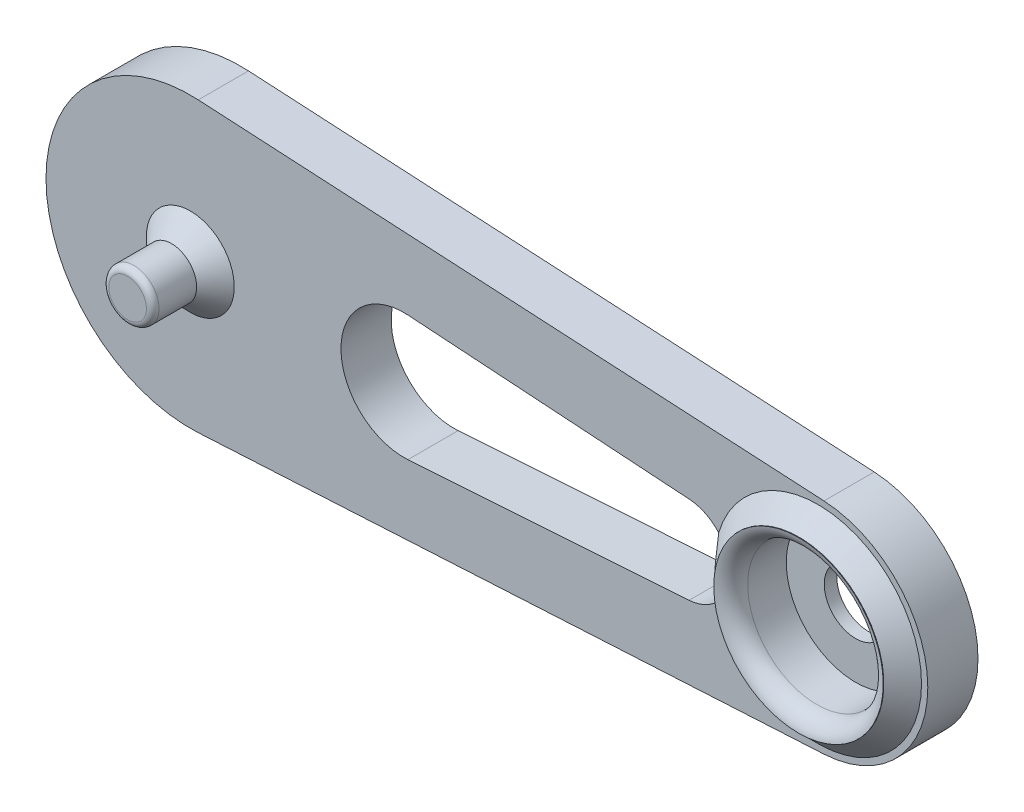
ISO-10303-21;
HEADER;
FILE_DESCRIPTION(('STEP AP214'),'2;1');
FILE_NAME('part.step','',(''),(''),'','','');
FILE_SCHEMA(('AUTOMOTIVE_DESIGN { 1 0 10303 214 1 1 1 1 }'));
ENDSEC;
DATA;
#1=APPLICATION_CONTEXT('core data for automotive mechanical design processes');
#2=APPLICATION_PROTOCOL_DEFINITION('international standard','automotive_design',2000,#1);
#3=PRODUCT_CONTEXT('',#1,'mechanical');
#4=PRODUCT('Part','Part','',(#3));
#5=PRODUCT_RELATED_PRODUCT_CATEGORY('part','',(#4));
#6=PRODUCT_DEFINITION_FORMATION('','',#4);
#7=PRODUCT_DEFINITION_CONTEXT('part definition',#1,'design');
#8=PRODUCT_DEFINITION('design','',#6,#7);
#9=PRODUCT_DEFINITION_SHAPE('','',#8);
#10=(LENGTH_UNIT() NAMED_UNIT(*) SI_UNIT(.MILLI.,.METRE.));
#11=(NAMED_UNIT(*) PLANE_ANGLE_UNIT() SI_UNIT($,.RADIAN.));
#12=(NAMED_UNIT(*) SI_UNIT($,.STERADIAN.) SOLID_ANGLE_UNIT());
#13=UNCERTAINTY_MEASURE_WITH_UNIT(LENGTH_MEASURE(1.E-05),#10,'distance_accuracy_value','');
#14=(GEOMETRIC_REPRESENTATION_CONTEXT(3) GLOBAL_UNCERTAINTY_ASSIGNED_CONTEXT((#13)) GLOBAL_UNIT_ASSIGNED_CONTEXT((#10,
#11,#12)) REPRESENTATION_CONTEXT('',''));
#15=CARTESIAN_POINT('',(0.,0.,0.));
#16=DIRECTION('',(0.,0.,1.));
#17=DIRECTION('',(1.,0.,0.));
#18=AXIS2_PLACEMENT_3D('',#15,#16,#17);
#19=CARTESIAN_POINT('',(100.,0.,-8.));
#20=DIRECTION('',(0.,0.,1.));
#21=DIRECTION('',(1.,0.,0.));
#22=AXIS2_PLACEMENT_3D('',#19,#20,#21);
#23=CYLINDRICAL_SURFACE('',#22,5.);
#24=CARTESIAN_POINT('',(100.,0.,-8.));
#25=DIRECTION('',(0.,0.,1.));
#26=DIRECTION('',(1.,0.,0.));
#27=AXIS2_PLACEMENT_3D('',#24,#25,#26);
#28=CIRCLE('',#27,5.);
#29=CARTESIAN_POINT('',(105.,0.,-8.));
#30=VERTEX_POINT('',#29);
#31=EDGE_CURVE('E159',#30,#30,#28,.T.);
#32=ORIENTED_EDGE('',*,*,#31,.F.);
#33=EDGE_LOOP('',(#32));
#34=FACE_BOUND('',#33,.T.);
#35=CARTESIAN_POINT('',(100.,0.,-6.));
#36=DIRECTION('',(0.,0.,1.));
#37=DIRECTION('',(1.,0.,0.));
#38=AXIS2_PLACEMENT_3D('',#35,#36,#37);
#39=CIRCLE('',#38,5.);
#40=CARTESIAN_POINT('',(105.,0.,-6.));
#41=VERTEX_POINT('',#40);
#42=EDGE_CURVE('E211',#41,#41,#39,.F.);
#43=ORIENTED_EDGE('',*,*,#42,.F.);
#44=EDGE_LOOP('',(#43));
#45=FACE_BOUND('',#44,.T.);
#46=ADVANCED_FACE('F41',(#34,#45),#23,.F.);
#47=CARTESIAN_POINT('',(0.,0.,10.));
#48=DIRECTION('',(0.,0.,-1.));
#49=DIRECTION('',(-1.,0.,0.));
#50=AXIS2_PLACEMENT_3D('',#47,#48,#49);
#51=CYLINDRICAL_SURFACE('',#50,4.);
#52=CARTESIAN_POINT('',(0.,0.,9.));
#53=DIRECTION('',(0.,0.,1.));
#54=DIRECTION('',(1.,0.,0.));
#55=AXIS2_PLACEMENT_3D('',#52,#53,#54);
#56=CIRCLE('',#55,4.);
#57=CARTESIAN_POINT('',(4.,0.,9.));
#58=VERTEX_POINT('',#57);
#59=EDGE_CURVE('E207',#58,#58,#56,.F.);
#60=ORIENTED_EDGE('',*,*,#59,.T.);
#61=EDGE_LOOP('',(#60));
#62=FACE_BOUND('',#61,.T.);
#63=CARTESIAN_POINT('',(0.,0.,3.00000000000001));
#64=DIRECTION('',(0.,0.,1.));
#65=DIRECTION('',(1.,0.,0.));
#66=AXIS2_PLACEMENT_3D('',#63,#64,#65);
#67=CIRCLE('',#66,4.);
#68=CARTESIAN_POINT('',(-4.,0.,3.00000000000001));
#69=VERTEX_POINT('',#68);
#70=EDGE_CURVE('E193',#69,#69,#67,.T.);
#71=ORIENTED_EDGE('',*,*,#70,.T.);
#72=EDGE_LOOP('',(#71));
#73=FACE_BOUND('',#72,.T.);
#74=ADVANCED_FACE('F237',(#62,#73),#51,.T.);
#75=CARTESIAN_POINT('',(0.,0.,10.));
#76=DIRECTION('',(0.,0.,1.));
#77=DIRECTION('',(1.,0.,0.));
#78=AXIS2_PLACEMENT_3D('',#75,#76,#77);
#79=PLANE('',#78);
#80=CARTESIAN_POINT('',(0.,0.,10.));
#81=DIRECTION('',(0.,0.,1.));
#82=DIRECTION('',(1.,0.,0.));
#83=AXIS2_PLACEMENT_3D('',#80,#81,#82);
#84=CIRCLE('',#83,3.);
#85=CARTESIAN_POINT('',(3.,0.,10.));
#86=VERTEX_POINT('',#85);
#87=EDGE_CURVE('E204',#86,#86,#84,.T.);
#88=ORIENTED_EDGE('',*,*,#87,.T.);
#89=EDGE_LOOP('',(#88));
#90=FACE_BOUND('',#89,.T.);
#91=ADVANCED_FACE('F245',(#90),#79,.T.);
#92=CARTESIAN_POINT('',(100.,0.,-8.));
#93=DIRECTION('',(0.,0.,1.));
#94=DIRECTION('',(1.,0.,0.));
#95=AXIS2_PLACEMENT_3D('',#92,#93,#94);
#96=CYLINDRICAL_SURFACE('',#95,17.5);
#97=CARTESIAN_POINT('',(100.,0.,0.));
#98=DIRECTION('',(0.,0.,1.));
#99=DIRECTION('',(1.,0.,0.));
#100=AXIS2_PLACEMENT_3D('',#97,#98,#99);
#101=CIRCLE('',#100,17.5);
#102=CARTESIAN_POINT('',(100.9625,-17.4735112026747,0.));
#103=VERTEX_POINT('',#102);
#104=CARTESIAN_POINT('',(100.9625,17.4735112026748,0.));
#105=VERTEX_POINT('',#104);
#106=EDGE_CURVE('E166',#103,#105,#101,.T.);
#107=ORIENTED_EDGE('',*,*,#106,.F.);
#108=DIRECTION('',(0.,0.,1.));
#109=VECTOR('',#108,1.);
#110=CARTESIAN_POINT('',(100.9625,-17.4735112026747,-8.));
#111=LINE('',#110,#109);
#112=CARTESIAN_POINT('',(100.9625,-17.4735112026747,-8.));
#113=VERTEX_POINT('',#112);
#114=EDGE_CURVE('E191',#113,#103,#111,.T.);
#115=ORIENTED_EDGE('',*,*,#114,.F.);
#116=CARTESIAN_POINT('',(100.,0.,-8.));
#117=DIRECTION('',(0.,0.,1.));
#118=DIRECTION('',(1.,0.,0.));
#119=AXIS2_PLACEMENT_3D('',#116,#117,#118);
#120=CIRCLE('',#119,17.5);
#121=CARTESIAN_POINT('',(100.9625,17.4735112026748,-8.));
#122=VERTEX_POINT('',#121);
#123=EDGE_CURVE('E167',#113,#122,#120,.T.);
#124=ORIENTED_EDGE('',*,*,#123,.T.);
#125=DIRECTION('',(0.,0.,1.));
#126=VECTOR('',#125,1.);
#127=CARTESIAN_POINT('',(100.9625,17.4735112026748,-8.));
#128=LINE('',#127,#126);
#129=EDGE_CURVE('E180',#122,#105,#128,.T.);
#130=ORIENTED_EDGE('',*,*,#129,.T.);
#131=EDGE_LOOP('',(#107,#115,#124,#130));
#132=FACE_BOUND('',#131,.T.);
#133=ADVANCED_FACE('F262',(#132),#96,.T.);
#134=CARTESIAN_POINT('',(100.9625,-17.4735112026747,-8.));
#135=DIRECTION('',(0.0550000000000001,-0.998486354438557,0.));
#136=DIRECTION('',(0.998486354438557,0.0550000000000001,0.));
#137=AXIS2_PLACEMENT_3D('',#134,#135,#136);
#138=PLANE('',#137);
#139=DIRECTION('',(0.998486354438557,0.0550000000000001,0.));
#140=VECTOR('',#139,1.);
#141=CARTESIAN_POINT('',(100.9625,-17.4735112026747,0.));
#142=LINE('',#141,#140);
#143=CARTESIAN_POINT('',(1.265,-22.9651861520868,0.));
#144=VERTEX_POINT('',#143);
#145=EDGE_CURVE('E171',#144,#103,#142,.T.);
#146=ORIENTED_EDGE('',*,*,#145,.F.);
#147=DIRECTION('',(0.,0.,1.));
#148=VECTOR('',#147,1.);
#149=CARTESIAN_POINT('',(1.265,-22.9651861520868,-8.));
#150=LINE('',#149,#148);
#151=CARTESIAN_POINT('',(1.265,-22.9651861520868,-8.));
#152=VERTEX_POINT('',#151);
#153=EDGE_CURVE('E194',#152,#144,#150,.T.);
#154=ORIENTED_EDGE('',*,*,#153,.F.);
#155=DIRECTION('',(0.998486354438557,0.0550000000000001,0.));
#156=VECTOR('',#155,1.);
#157=CARTESIAN_POINT('',(100.9625,-17.4735112026747,-8.));
#158=LINE('',#157,#156);
#159=EDGE_CURVE('E177',#152,#113,#158,.T.);
#160=ORIENTED_EDGE('',*,*,#159,.T.);
#161=ORIENTED_EDGE('',*,*,#114,.T.);
#162=EDGE_LOOP('',(#146,#154,#160,#161));
#163=FACE_BOUND('',#162,.T.);
#164=ADVANCED_FACE('F258',(#163),#138,.T.);
#165=CARTESIAN_POINT('',(0.,0.,-8.));
#166=DIRECTION('',(0.,0.,1.));
#167=DIRECTION('',(1.,0.,0.));
#168=AXIS2_PLACEMENT_3D('',#165,#166,#167);
#169=CYLINDRICAL_SURFACE('',#168,23.);
#170=CARTESIAN_POINT('',(0.,0.,0.));
#171=DIRECTION('',(0.,0.,1.));
#172=DIRECTION('',(1.,0.,0.));
#173=AXIS2_PLACEMENT_3D('',#170,#171,#172);
#174=CIRCLE('',#173,23.);
#175=CARTESIAN_POINT('',(1.265,22.9651861520868,0.));
#176=VERTEX_POINT('',#175);
#177=EDGE_CURVE('E186',#176,#144,#174,.T.);
#178=ORIENTED_EDGE('',*,*,#177,.F.);
#179=DIRECTION('',(0.,0.,1.));
#180=VECTOR('',#179,1.);
#181=CARTESIAN_POINT('',(1.265,22.9651861520868,-8.));
#182=LINE('',#181,#180);
#183=CARTESIAN_POINT('',(1.265,22.9651861520868,-8.));
#184=VERTEX_POINT('',#183);
#185=EDGE_CURVE('E196',#184,#176,#182,.T.);
#186=ORIENTED_EDGE('',*,*,#185,.F.);
#187=CARTESIAN_POINT('',(0.,0.,-8.));
#188=DIRECTION('',(0.,0.,1.));
#189=DIRECTION('',(1.,0.,0.));
#190=AXIS2_PLACEMENT_3D('',#187,#188,#189);
#191=CIRCLE('',#190,23.);
#192=EDGE_CURVE('E174',#184,#152,#191,.T.);
#193=ORIENTED_EDGE('',*,*,#192,.T.);
#194=ORIENTED_EDGE('',*,*,#153,.T.);
#195=EDGE_LOOP('',(#178,#186,#193,#194));
#196=FACE_BOUND('',#195,.T.);
#197=ADVANCED_FACE('F261',(#196),#169,.T.);
#198=CARTESIAN_POINT('',(100.9625,17.4735112026748,-8.));
#199=DIRECTION('',(0.0549999999999998,0.998486354438557,0.));
#200=DIRECTION('',(-0.998486354438557,0.0549999999999998,0.));
#201=AXIS2_PLACEMENT_3D('',#198,#199,#200);
#202=PLANE('',#201);
#203=DIRECTION('',(-0.998486354438557,0.0549999999999998,0.));
#204=VECTOR('',#203,1.);
#205=CARTESIAN_POINT('',(100.9625,17.4735112026748,0.));
#206=LINE('',#205,#204);
#207=EDGE_CURVE('E183',#105,#176,#206,.T.);
#208=ORIENTED_EDGE('',*,*,#207,.F.);
#209=ORIENTED_EDGE('',*,*,#129,.F.);
#210=DIRECTION('',(-0.998486354438557,0.0549999999999998,0.));
#211=VECTOR('',#210,1.);
#212=CARTESIAN_POINT('',(100.9625,17.4735112026748,-8.));
#213=LINE('',#212,#211);
#214=EDGE_CURVE('E170',#122,#184,#213,.T.);
#215=ORIENTED_EDGE('',*,*,#214,.T.);
#216=ORIENTED_EDGE('',*,*,#185,.T.);
#217=EDGE_LOOP('',(#208,#209,#215,#216));
#218=FACE_BOUND('',#217,.T.);
#219=ADVANCED_FACE('F254',(#218),#202,.T.);
#220=CARTESIAN_POINT('',(100.,0.,-8.));
#221=DIRECTION('',(0.,0.,1.));
#222=DIRECTION('',(1.,0.,0.));
#223=AXIS2_PLACEMENT_3D('',#220,#221,#222);
#224=PLANE('',#223);
#225=DIRECTION('',(-0.997775303139718,0.0666666666666665,0.));
#226=VECTOR('',#225,1.);
#227=CARTESIAN_POINT('',(34.6666666666667,9.97775303139718,-8.));
#228=LINE('',#227,#226);
#229=CARTESIAN_POINT('',(79.4666666666667,6.98442712197804,-8.));
#230=VERTEX_POINT('',#229);
#231=CARTESIAN_POINT('',(34.6666666666667,9.97775303139718,-8.));
#232=VERTEX_POINT('',#231);
#233=EDGE_CURVE('E128',#230,#232,#228,.T.);
#234=ORIENTED_EDGE('',*,*,#233,.T.);
#235=CARTESIAN_POINT('',(34.,0.,-8.));
#236=DIRECTION('',(0.,0.,1.));
#237=DIRECTION('',(1.,0.,0.));
#238=AXIS2_PLACEMENT_3D('',#235,#236,#237);
#239=CIRCLE('',#238,10.);
#240=CARTESIAN_POINT('',(34.6666666666667,-9.97775303139718,-8.));
#241=VERTEX_POINT('',#240);
#242=EDGE_CURVE('E120',#232,#241,#239,.T.);
#243=ORIENTED_EDGE('',*,*,#242,.T.);
#244=DIRECTION('',(0.997775303139718,0.0666666666666668,0.));
#245=VECTOR('',#244,1.);
#246=CARTESIAN_POINT('',(34.6666666666667,-9.97775303139718,-8.));
#247=LINE('',#246,#245);
#248=CARTESIAN_POINT('',(79.4666666666667,-6.98442712197802,-8.));
#249=VERTEX_POINT('',#248);
#250=EDGE_CURVE('E132',#241,#249,#247,.T.);
#251=ORIENTED_EDGE('',*,*,#250,.T.);
#252=CARTESIAN_POINT('',(79.,0.,-8.));
#253=DIRECTION('',(0.,0.,1.));
#254=DIRECTION('',(1.,0.,0.));
#255=AXIS2_PLACEMENT_3D('',#252,#253,#254);
#256=CIRCLE('',#255,7.);
#257=EDGE_CURVE('E136',#249,#230,#256,.T.);
#258=ORIENTED_EDGE('',*,*,#257,.T.);
#259=EDGE_LOOP('',(#234,#243,#251,#258));
#260=FACE_BOUND('',#259,.T.);
#261=ORIENTED_EDGE('',*,*,#31,.T.);
#262=EDGE_LOOP('',(#261));
#263=FACE_BOUND('',#262,.T.);
#264=ORIENTED_EDGE('',*,*,#123,.F.);
#265=ORIENTED_EDGE('',*,*,#159,.F.);
#266=ORIENTED_EDGE('',*,*,#192,.F.);
#267=ORIENTED_EDGE('',*,*,#214,.F.);
#268=EDGE_LOOP('',(#264,#265,#266,#267));
#269=FACE_BOUND('',#268,.T.);
#270=ADVANCED_FACE('F138',(#260,#263,#269),#224,.F.);
#271=CARTESIAN_POINT('',(100.,0.,0.));
#272=DIRECTION('',(0.,0.,1.));
#273=DIRECTION('',(1.,0.,0.));
#274=AXIS2_PLACEMENT_3D('',#271,#272,#273);
#275=PLANE('',#274);
#276=CARTESIAN_POINT('',(0.,0.,0.));
#277=DIRECTION('',(0.,0.,1.));
#278=DIRECTION('',(1.,0.,0.));
#279=AXIS2_PLACEMENT_3D('',#276,#277,#278);
#280=CIRCLE('',#279,6.99999999999998);
#281=CARTESIAN_POINT('',(-6.99999999999998,0.,0.));
#282=VERTEX_POINT('',#281);
#283=EDGE_CURVE('E201',#282,#282,#280,.F.);
#284=ORIENTED_EDGE('',*,*,#283,.T.);
#285=EDGE_LOOP('',(#284));
#286=FACE_BOUND('',#285,.T.);
#287=CARTESIAN_POINT('',(79.,0.,0.));
#288=DIRECTION('',(0.,0.,1.));
#289=DIRECTION('',(1.,0.,0.));
#290=AXIS2_PLACEMENT_3D('',#287,#288,#289);
#291=CIRCLE('',#290,7.);
#292=CARTESIAN_POINT('',(84.1845238095238,4.70326619153976,0.));
#293=VERTEX_POINT('',#292);
#294=CARTESIAN_POINT('',(79.4666666666667,6.98442712197804,0.));
#295=VERTEX_POINT('',#294);
#296=EDGE_CURVE('E155',#293,#295,#291,.T.);
#297=ORIENTED_EDGE('',*,*,#296,.F.);
#298=CARTESIAN_POINT('',(100.,0.,0.));
#299=DIRECTION('',(0.,0.,1.));
#300=DIRECTION('',(1.,0.,0.));
#301=AXIS2_PLACEMENT_3D('',#298,#299,#300);
#302=CIRCLE('',#301,16.5);
#303=CARTESIAN_POINT('',(84.1845238095238,-4.70326619153974,0.));
#304=VERTEX_POINT('',#303);
#305=EDGE_CURVE('E56',#293,#304,#302,.F.);
#306=ORIENTED_EDGE('',*,*,#305,.T.);
#307=CARTESIAN_POINT('',(79.4666666666667,-6.98442712197802,0.));
#308=VERTEX_POINT('',#307);
#309=EDGE_CURVE('E144',#308,#304,#291,.T.);
#310=ORIENTED_EDGE('',*,*,#309,.F.);
#311=DIRECTION('',(0.997775303139718,0.0666666666666668,0.));
#312=VECTOR('',#311,1.);
#313=CARTESIAN_POINT('',(34.6666666666667,-9.97775303139718,0.));
#314=LINE('',#313,#312);
#315=CARTESIAN_POINT('',(34.6666666666667,-9.97775303139718,0.));
#316=VERTEX_POINT('',#315);
#317=EDGE_CURVE('E153',#316,#308,#314,.T.);
#318=ORIENTED_EDGE('',*,*,#317,.F.);
#319=CARTESIAN_POINT('',(34.,0.,0.));
#320=DIRECTION('',(0.,0.,1.));
#321=DIRECTION('',(1.,0.,0.));
#322=AXIS2_PLACEMENT_3D('',#319,#320,#321);
#323=CIRCLE('',#322,10.);
#324=CARTESIAN_POINT('',(34.6666666666667,9.97775303139718,0.));
#325=VERTEX_POINT('',#324);
#326=EDGE_CURVE('E123',#325,#316,#323,.T.);
#327=ORIENTED_EDGE('',*,*,#326,.F.);
#328=DIRECTION('',(-0.997775303139718,0.0666666666666665,0.));
#329=VECTOR('',#328,1.);
#330=CARTESIAN_POINT('',(34.6666666666667,9.97775303139718,0.));
#331=LINE('',#330,#329);
#332=EDGE_CURVE('E141',#295,#325,#331,.T.);
#333=ORIENTED_EDGE('',*,*,#332,.F.);
#334=EDGE_LOOP('',(#297,#306,#310,#318,#327,#333));
#335=FACE_BOUND('',#334,.T.);
#336=ORIENTED_EDGE('',*,*,#106,.T.);
#337=ORIENTED_EDGE('',*,*,#207,.T.);
#338=ORIENTED_EDGE('',*,*,#177,.T.);
#339=ORIENTED_EDGE('',*,*,#145,.T.);
#340=EDGE_LOOP('',(#336,#337,#338,#339));
#341=FACE_BOUND('',#340,.T.);
#342=ADVANCED_FACE('F221',(#286,#335,#341),#275,.T.);
#343=CARTESIAN_POINT('',(34.,0.,-8.));
#344=DIRECTION('',(0.,0.,1.));
#345=DIRECTION('',(1.,0.,0.));
#346=AXIS2_PLACEMENT_3D('',#343,#344,#345);
#347=CYLINDRICAL_SURFACE('',#346,10.);
#348=ORIENTED_EDGE('',*,*,#326,.T.);
#349=DIRECTION('',(0.,0.,1.));
#350=VECTOR('',#349,1.);
#351=CARTESIAN_POINT('',(34.6666666666667,-9.97775303139718,-8.));
#352=LINE('',#351,#350);
#353=EDGE_CURVE('E116',#241,#316,#352,.T.);
#354=ORIENTED_EDGE('',*,*,#353,.F.);
#355=ORIENTED_EDGE('',*,*,#242,.F.);
#356=DIRECTION('',(0.,0.,1.));
#357=VECTOR('',#356,1.);
#358=CARTESIAN_POINT('',(34.6666666666667,9.97775303139718,-8.));
#359=LINE('',#358,#357);
#360=EDGE_CURVE('E157',#232,#325,#359,.T.);
#361=ORIENTED_EDGE('',*,*,#360,.T.);
#362=EDGE_LOOP('',(#348,#354,#355,#361));
#363=FACE_BOUND('',#362,.T.);
#364=ADVANCED_FACE('F118',(#363),#347,.F.);
#365=CARTESIAN_POINT('',(34.6666666666667,9.97775303139718,-8.));
#366=DIRECTION('',(0.0666666666666665,0.997775303139718,0.));
#367=DIRECTION('',(-0.997775303139718,0.0666666666666665,0.));
#368=AXIS2_PLACEMENT_3D('',#365,#366,#367);
#369=PLANE('',#368);
#370=ORIENTED_EDGE('',*,*,#332,.T.);
#371=ORIENTED_EDGE('',*,*,#360,.F.);
#372=ORIENTED_EDGE('',*,*,#233,.F.);
#373=DIRECTION('',(0.,0.,1.));
#374=VECTOR('',#373,1.);
#375=CARTESIAN_POINT('',(79.4666666666667,6.98442712197804,-8.));
#376=LINE('',#375,#374);
#377=EDGE_CURVE('E160',#230,#295,#376,.T.);
#378=ORIENTED_EDGE('',*,*,#377,.T.);
#379=EDGE_LOOP('',(#370,#371,#372,#378));
#380=FACE_BOUND('',#379,.T.);
#381=ADVANCED_FACE('F226',(#380),#369,.F.);
#382=CARTESIAN_POINT('',(79.,0.,-8.));
#383=DIRECTION('',(0.,0.,1.));
#384=DIRECTION('',(1.,0.,0.));
#385=AXIS2_PLACEMENT_3D('',#382,#383,#384);
#386=CYLINDRICAL_SURFACE('',#385,7.);
#387=ORIENTED_EDGE('',*,*,#309,.T.);
#388=CARTESIAN_POINT('',(84.1845238095238,-4.70326619153974,0.));
#389=CARTESIAN_POINT('',(84.2959618588413,-4.58036779518737,0.141805841492395));
#390=CARTESIAN_POINT('',(84.4043357567353,-4.45217962644761,0.281588698835906));
#391=CARTESIAN_POINT('',(84.6143782093548,-4.18425155328609,0.555886121977293));
#392=CARTESIAN_POINT('',(84.7160285544168,-4.0444824162761,0.690386009683071));
#393=CARTESIAN_POINT('',(84.913045820837,-3.75068506226197,0.954267426420549));
#394=CARTESIAN_POINT('',(85.0082837128279,-3.59646196022168,1.08353018488714));
#395=CARTESIAN_POINT('',(85.189260237765,-3.2752133551191,1.33205698601912));
#396=CARTESIAN_POINT('',(85.2750091709588,-3.10820207363874,1.45133183562374));
#397=CARTESIAN_POINT('',(85.4563595621239,-2.71543236674105,1.70631820425314));
#398=CARTESIAN_POINT('',(85.5487511097362,-2.48566942560626,1.8382731623453));
#399=CARTESIAN_POINT('',(85.7113267892251,-2.00547039303148,2.07300984634084));
#400=CARTESIAN_POINT('',(85.7816184239846,-1.75514209103261,2.17593253711493));
#401=CARTESIAN_POINT('',(85.8853535846785,-1.28065440171335,2.32890090882414));
#402=CARTESIAN_POINT('',(85.9230666105237,-1.05945280924853,2.38501192059398));
#403=CARTESIAN_POINT('',(85.9636356021357,-0.721614211030372,2.4455457922693));
#404=CARTESIAN_POINT('',(85.9744928763946,-0.607952869493947,2.46178657817704));
#405=CARTESIAN_POINT('',(85.9906488600133,-0.37937499063384,2.48597475653298));
#406=CARTESIAN_POINT('',(85.9959496849549,-0.264458947880527,2.49392530542886));
#407=CARTESIAN_POINT('',(86.0008703520642,-0.0339183067725517,2.50130515647221));
#408=CARTESIAN_POINT('',(86.0004745542928,0.0817073707493894,2.50071099934077));
#409=CARTESIAN_POINT('',(85.9939762780504,0.312432073064875,2.49096648603589));
#410=CARTESIAN_POINT('',(85.9878738875212,0.427531105946836,2.48181626171616));
#411=CARTESIAN_POINT('',(85.9701051413556,0.656360703197615,2.45522306873854));
#412=CARTESIAN_POINT('',(85.9584371058528,0.770090843764191,2.4377775963493));
#413=CARTESIAN_POINT('',(85.929792677373,0.995432732457495,2.39506602947353));
#414=CARTESIAN_POINT('',(85.9128136730622,1.10704340977509,2.36979608785989));
#415=CARTESIAN_POINT('',(85.8696202834772,1.35163736626946,2.30573417071196));
#416=CARTESIAN_POINT('',(85.8421978778602,1.48395131082995,2.2651931116609));
#417=CARTESIAN_POINT('',(85.7806508788529,1.74374009241512,2.17468251102454));
#418=CARTESIAN_POINT('',(85.7465216074233,1.87121147727238,2.12470638944431));
#419=CARTESIAN_POINT('',(85.6350091015701,2.24602508296581,1.96242015683818));
#420=CARTESIAN_POINT('',(85.5485580050606,2.48546006051835,1.83783766828174));
#421=CARTESIAN_POINT('',(85.3794264934019,2.8876764703804,1.59782065725687));
#422=CARTESIAN_POINT('',(85.3007077801138,3.05517648279159,1.48721504546117));
#423=CARTESIAN_POINT('',(85.1337564274135,3.37787099383078,1.25547168086101));
#424=CARTESIAN_POINT('',(85.0455177265697,3.53305754198817,1.13432722753388));
#425=CARTESIAN_POINT('',(84.8608968426531,3.83153967045808,0.884046343551766));
#426=CARTESIAN_POINT('',(84.7645157386549,3.97483682144335,0.754910972500718));
#427=CARTESIAN_POINT('',(84.5646113528576,4.25017864146472,0.490509447274456));
#428=CARTESIAN_POINT('',(84.4610916263759,4.38222883972426,0.35524635629921));
#429=CARTESIAN_POINT('',(84.326482420086,4.54207652635398,0.181634911420422));
#430=CARTESIAN_POINT('',(84.2983611441563,4.57484667169193,0.145485266107627));
#431=CARTESIAN_POINT('',(84.2417371294226,4.63961632898623,0.0729384291172401));
#432=CARTESIAN_POINT('',(84.2132350894296,4.67161701324871,0.036541738771383));
#433=CARTESIAN_POINT('',(84.1845238095238,4.70326619153977,0.));
#434=B_SPLINE_CURVE_WITH_KNOTS('',3,(#388,#389,#390,#391,#392,#393,#394,#395,#396,#397,#398,
#399,#400,#401,#402,#403,#404,#405,#406,#407,#408,#409,#410,#411,#412,#413,#414,#415,#416,#417,
#418,#419,#420,#421,#422,#423,#424,#425,#426,#427,#428,#429,#430,#431,#432,#433),.UNSPECIFIED.,
.F.,.F.,(4,2,2,2,2,2,2,2,2,2,2,2,2,2,2,2,2,2,2,2,2,2,4),(0.,0.654789403239251,1.31128514682194,
1.97845453950273,2.64489246599215,3.48412258986543,4.31920483069362,5.00991541095119,
5.35552220264417,5.70099735895391,6.04742118940192,6.39383968135604,6.74036279826153,
7.08705656458015,7.50963812681459,7.93251549263761,8.77922836111126,9.42528207486954,
10.0717495898389,10.7181315654822,11.3641939103809,11.5331382525388,11.7018063904245),.UNSPECIFIED.);
#435=EDGE_CURVE('E11',#304,#293,#434,.T.);
#436=ORIENTED_EDGE('',*,*,#435,.T.);
#437=ORIENTED_EDGE('',*,*,#296,.T.);
#438=ORIENTED_EDGE('',*,*,#377,.F.);
#439=ORIENTED_EDGE('',*,*,#257,.F.);
#440=DIRECTION('',(0.,0.,1.));
#441=VECTOR('',#440,1.);
#442=CARTESIAN_POINT('',(79.4666666666667,-6.98442712197802,-8.));
#443=LINE('',#442,#441);
#444=EDGE_CURVE('E127',#249,#308,#443,.T.);
#445=ORIENTED_EDGE('',*,*,#444,.T.);
#446=EDGE_LOOP('',(#387,#436,#437,#438,#439,#445));
#447=FACE_BOUND('',#446,.T.);
#448=ADVANCED_FACE('F224',(#447),#386,.F.);
#449=CARTESIAN_POINT('',(34.6666666666667,-9.97775303139718,-8.));
#450=DIRECTION('',(0.0666666666666668,-0.997775303139718,0.));
#451=DIRECTION('',(0.997775303139718,0.0666666666666668,0.));
#452=AXIS2_PLACEMENT_3D('',#449,#450,#451);
#453=PLANE('',#452);
#454=ORIENTED_EDGE('',*,*,#317,.T.);
#455=ORIENTED_EDGE('',*,*,#444,.F.);
#456=ORIENTED_EDGE('',*,*,#250,.F.);
#457=ORIENTED_EDGE('',*,*,#353,.T.);
#458=EDGE_LOOP('',(#454,#455,#456,#457));
#459=FACE_BOUND('',#458,.T.);
#460=ADVANCED_FACE('F133',(#459),#453,.F.);
#461=CARTESIAN_POINT('',(0.,0.,3.00000000000001));
#462=DIRECTION('',(0.,0.,-1.));
#463=DIRECTION('',(-1.,0.,0.));
#464=AXIS2_PLACEMENT_3D('',#461,#462,#463);
#465=CONICAL_SURFACE('',#464,4.,0.785398163397444);
#466=CARTESIAN_POINT('',(-6.99999999999998,0.,0.));
#467=CARTESIAN_POINT('',(-6.96874999999998,0.,0.0312499999999998));
#468=CARTESIAN_POINT('',(-6.93749999999998,0.,0.0624999999999998));
#469=CARTESIAN_POINT('',(-6.87499999999998,0.,0.125));
#470=CARTESIAN_POINT('',(-6.84374999999998,0.,0.15625));
#471=CARTESIAN_POINT('',(-6.78124999999998,0.,0.21875));
#472=CARTESIAN_POINT('',(-6.74999999999998,0.,0.25));
#473=CARTESIAN_POINT('',(-6.68749999999998,0.,0.3125));
#474=CARTESIAN_POINT('',(-6.65624999999998,0.,0.34375));
#475=CARTESIAN_POINT('',(-6.59374999999998,0.,0.40625));
#476=CARTESIAN_POINT('',(-6.56249999999998,0.,0.437500000000001));
#477=CARTESIAN_POINT('',(-6.49999999999998,0.,0.500000000000001));
#478=CARTESIAN_POINT('',(-6.46874999999998,0.,0.531250000000001));
#479=CARTESIAN_POINT('',(-6.40624999999998,0.,0.593750000000001));
#480=CARTESIAN_POINT('',(-6.37499999999998,0.,0.625000000000001));
#481=CARTESIAN_POINT('',(-6.31249999999998,0.,0.687500000000001));
#482=CARTESIAN_POINT('',(-6.28124999999998,0.,0.718750000000001));
#483=CARTESIAN_POINT('',(-6.21874999999998,0.,0.781250000000001));
#484=CARTESIAN_POINT('',(-6.18749999999998,0.,0.812500000000001));
#485=CARTESIAN_POINT('',(-6.12499999999999,0.,0.875000000000002));
#486=CARTESIAN_POINT('',(-6.09374999999999,0.,0.906250000000002));
#487=CARTESIAN_POINT('',(-6.03124999999999,0.,0.968750000000002));
#488=CARTESIAN_POINT('',(-5.99999999999999,0.,1.));
#489=CARTESIAN_POINT('',(-5.93749999999999,0.,1.0625));
#490=CARTESIAN_POINT('',(-5.90624999999999,0.,1.09375));
#491=CARTESIAN_POINT('',(-5.84374999999999,0.,1.15625));
#492=CARTESIAN_POINT('',(-5.81249999999999,0.,1.1875));
#493=CARTESIAN_POINT('',(-5.74999999999999,0.,1.25));
#494=CARTESIAN_POINT('',(-5.71874999999999,0.,1.28125));
#495=CARTESIAN_POINT('',(-5.65624999999999,0.,1.34375));
#496=CARTESIAN_POINT('',(-5.62499999999999,0.,1.375));
#497=CARTESIAN_POINT('',(-5.56249999999999,0.,1.4375));
#498=CARTESIAN_POINT('',(-5.53124999999999,0.,1.46875));
#499=CARTESIAN_POINT('',(-5.46874999999999,0.,1.53125));
#500=CARTESIAN_POINT('',(-5.43749999999999,0.,1.5625));
#501=CARTESIAN_POINT('',(-5.37499999999999,0.,1.625));
#502=CARTESIAN_POINT('',(-5.34374999999999,0.,1.65625));
#503=CARTESIAN_POINT('',(-5.28124999999999,0.,1.71875));
#504=CARTESIAN_POINT('',(-5.24999999999999,0.,1.75));
#505=CARTESIAN_POINT('',(-5.18749999999999,0.,1.8125));
#506=CARTESIAN_POINT('',(-5.15624999999999,0.,1.84375));
#507=CARTESIAN_POINT('',(-5.09374999999999,0.,1.90625));
#508=CARTESIAN_POINT('',(-5.06249999999999,0.,1.9375));
#509=CARTESIAN_POINT('',(-4.99999999999999,0.,2.));
#510=CARTESIAN_POINT('',(-4.96874999999999,0.,2.03125));
#511=CARTESIAN_POINT('',(-4.90624999999999,0.,2.09375));
#512=CARTESIAN_POINT('',(-4.87499999999999,0.,2.125));
#513=CARTESIAN_POINT('',(-4.81249999999999,0.,2.1875));
#514=CARTESIAN_POINT('',(-4.78124999999999,0.,2.21875));
#515=CARTESIAN_POINT('',(-4.71874999999999,0.,2.28125));
#516=CARTESIAN_POINT('',(-4.6875,0.,2.3125));
#517=CARTESIAN_POINT('',(-4.625,0.,2.375));
#518=CARTESIAN_POINT('',(-4.59375,0.,2.40625));
#519=CARTESIAN_POINT('',(-4.53125,0.,2.46875));
#520=CARTESIAN_POINT('',(-4.5,0.,2.5));
#521=CARTESIAN_POINT('',(-4.4375,0.,2.5625));
#522=CARTESIAN_POINT('',(-4.40625,0.,2.59375));
#523=CARTESIAN_POINT('',(-4.34375,0.,2.65625000000001));
#524=CARTESIAN_POINT('',(-4.3125,0.,2.68750000000001));
#525=CARTESIAN_POINT('',(-4.25,0.,2.75000000000001));
#526=CARTESIAN_POINT('',(-4.21875,0.,2.78125000000001));
#527=CARTESIAN_POINT('',(-4.15625,0.,2.84375000000001));
#528=CARTESIAN_POINT('',(-4.125,0.,2.87500000000001));
#529=CARTESIAN_POINT('',(-4.0625,0.,2.93750000000001));
#530=CARTESIAN_POINT('',(-4.03125,0.,2.96875000000001));
#531=CARTESIAN_POINT('',(-4.,0.,3.00000000000001));
#532=B_SPLINE_CURVE_WITH_KNOTS('',3,(#466,#467,#468,#469,#470,#471,#472,#473,#474,#475,#476,
#477,#478,#479,#480,#481,#482,#483,#484,#485,#486,#487,#488,#489,#490,#491,#492,#493,#494,#495,
#496,#497,#498,#499,#500,#501,#502,#503,#504,#505,#506,#507,#508,#509,#510,#511,#512,#513,#514,
#515,#516,#517,#518,#519,#520,#521,#522,#523,#524,#525,#526,#527,#528,#529,#530,#531),
.UNSPECIFIED.,.F.,.F.,(4,2,2,2,2,2,2,2,2,2,2,2,2,2,2,2,2,2,2,2,2,2,2,2,2,2,2,2,2,2,2,2,4),(0.,
0.132582521472477,0.265165042944955,0.397747564417432,0.53033008588991,0.662912607362387,
0.795495128834864,0.928077650307341,1.06066017177982,1.1932426932523,1.32582521472477,
1.45840773619725,1.59099025766973,1.72357277914221,1.85615530061468,1.98873782208716,
2.12132034355964,2.25390286503212,2.38648538650459,2.51906790797707,2.65165042944955,
2.78423295092202,2.9168154723945,3.04939799386698,3.18198051533946,3.31456303681193,
3.44714555828441,3.57972807975689,3.71231060122937,3.84489312270184,3.97747564417432,
4.1100581656468,4.24264068711928),.UNSPECIFIED.);
#533=EDGE_CURVE('BSEAM277',#282,#69,#532,.T.);
#534=ORIENTED_EDGE('',*,*,#283,.F.);
#535=ORIENTED_EDGE('',*,*,#70,.F.);
#536=ORIENTED_EDGE('',*,*,#533,.T.);
#537=ORIENTED_EDGE('',*,*,#533,.F.);
#538=EDGE_LOOP('',(#534,#536,#535,#537));
#539=FACE_BOUND('',#538,.T.);
#540=ADVANCED_FACE('F277',(#539),#465,.T.);
#541=CARTESIAN_POINT('',(0.,0.,9.));
#542=DIRECTION('',(0.,0.,1.));
#543=DIRECTION('',(1.,0.,0.));
#544=AXIS2_PLACEMENT_3D('',#541,#542,#543);
#545=TOROIDAL_SURFACE('',#544,3.,1.);
#546=ORIENTED_EDGE('',*,*,#59,.F.);
#547=EDGE_LOOP('',(#546));
#548=FACE_BOUND('',#547,.T.);
#549=ORIENTED_EDGE('',*,*,#87,.F.);
#550=EDGE_LOOP('',(#549));
#551=FACE_BOUND('',#550,.T.);
#552=ADVANCED_FACE('F282',(#548,#551),#545,.T.);
#553=CARTESIAN_POINT('',(100.,0.,3.1));
#554=DIRECTION('',(0.,0.,-1.));
#555=DIRECTION('',(-1.,0.,0.));
#556=AXIS2_PLACEMENT_3D('',#553,#554,#555);
#557=CYLINDRICAL_SURFACE('',#556,13.5);
#558=CARTESIAN_POINT('',(100.,0.,3.00000000000005));
#559=DIRECTION('',(0.,0.,1.));
#560=DIRECTION('',(1.,0.,0.));
#561=AXIS2_PLACEMENT_3D('',#558,#559,#560);
#562=CIRCLE('',#561,13.5);
#563=CARTESIAN_POINT('',(86.5,0.,3.00000000000005));
#564=VERTEX_POINT('',#563);
#565=EDGE_CURVE('E217',#564,#564,#562,.T.);
#566=CARTESIAN_POINT('',(100.,0.,3.1));
#567=DIRECTION('',(0.,0.,1.));
#568=DIRECTION('',(1.,0.,0.));
#569=AXIS2_PLACEMENT_3D('',#566,#567,#568);
#570=CIRCLE('',#569,13.5);
#571=CARTESIAN_POINT('',(86.5,0.,3.1));
#572=VERTEX_POINT('',#571);
#573=EDGE_CURVE('E147',#572,#572,#570,.T.);
#574=CARTESIAN_POINT('',(86.5,0.,3.00000000000005));
#575=CARTESIAN_POINT('',(86.5,0.,3.00104166666672));
#576=CARTESIAN_POINT('',(86.5,0.,3.00208333333338));
#577=CARTESIAN_POINT('',(86.5,0.,3.00416666666672));
#578=CARTESIAN_POINT('',(86.5,0.,3.00520833333338));
#579=CARTESIAN_POINT('',(86.5,0.,3.00729166666672));
#580=CARTESIAN_POINT('',(86.5,0.,3.00833333333338));
#581=CARTESIAN_POINT('',(86.5,0.,3.01041666666671));
#582=CARTESIAN_POINT('',(86.5,0.,3.01145833333338));
#583=CARTESIAN_POINT('',(86.5,0.,3.01354166666671));
#584=CARTESIAN_POINT('',(86.5,0.,3.01458333333338));
#585=CARTESIAN_POINT('',(86.5,0.,3.01666666666671));
#586=CARTESIAN_POINT('',(86.5,0.,3.01770833333338));
#587=CARTESIAN_POINT('',(86.5,0.,3.01979166666671));
#588=CARTESIAN_POINT('',(86.5,0.,3.02083333333337));
#589=CARTESIAN_POINT('',(86.5,0.,3.02291666666671));
#590=CARTESIAN_POINT('',(86.5,0.,3.02395833333337));
#591=CARTESIAN_POINT('',(86.5,0.,3.02604166666671));
#592=CARTESIAN_POINT('',(86.5,0.,3.02708333333337));
#593=CARTESIAN_POINT('',(86.5,0.,3.0291666666667));
#594=CARTESIAN_POINT('',(86.5,0.,3.03020833333337));
#595=CARTESIAN_POINT('',(86.5,0.,3.0322916666667));
#596=CARTESIAN_POINT('',(86.5,0.,3.03333333333337));
#597=CARTESIAN_POINT('',(86.5,0.,3.0354166666667));
#598=CARTESIAN_POINT('',(86.5,0.,3.03645833333337));
#599=CARTESIAN_POINT('',(86.5,0.,3.0385416666667));
#600=CARTESIAN_POINT('',(86.5,0.,3.03958333333336));
#601=CARTESIAN_POINT('',(86.5,0.,3.0416666666667));
#602=CARTESIAN_POINT('',(86.5,0.,3.04270833333336));
#603=CARTESIAN_POINT('',(86.5,0.,3.0447916666667));
#604=CARTESIAN_POINT('',(86.5,0.,3.04583333333336));
#605=CARTESIAN_POINT('',(86.5,0.,3.04791666666669));
#606=CARTESIAN_POINT('',(86.5,0.,3.04895833333336));
#607=CARTESIAN_POINT('',(86.5,0.,3.05104166666669));
#608=CARTESIAN_POINT('',(86.5,0.,3.05208333333336));
#609=CARTESIAN_POINT('',(86.5,0.,3.05416666666669));
#610=CARTESIAN_POINT('',(86.5,0.,3.05520833333336));
#611=CARTESIAN_POINT('',(86.5,0.,3.05729166666669));
#612=CARTESIAN_POINT('',(86.5,0.,3.05833333333335));
#613=CARTESIAN_POINT('',(86.5,0.,3.06041666666669));
#614=CARTESIAN_POINT('',(86.5,0.,3.06145833333335));
#615=CARTESIAN_POINT('',(86.5,0.,3.06354166666669));
#616=CARTESIAN_POINT('',(86.5,0.,3.06458333333335));
#617=CARTESIAN_POINT('',(86.5,0.,3.06666666666668));
#618=CARTESIAN_POINT('',(86.5,0.,3.06770833333335));
#619=CARTESIAN_POINT('',(86.5,0.,3.06979166666668));
#620=CARTESIAN_POINT('',(86.5,0.,3.07083333333335));
#621=CARTESIAN_POINT('',(86.5,0.,3.07291666666668));
#622=CARTESIAN_POINT('',(86.5,0.,3.07395833333335));
#623=CARTESIAN_POINT('',(86.5,0.,3.07604166666668));
#624=CARTESIAN_POINT('',(86.5,0.,3.07708333333334));
#625=CARTESIAN_POINT('',(86.5,0.,3.07916666666668));
#626=CARTESIAN_POINT('',(86.5,0.,3.08020833333334));
#627=CARTESIAN_POINT('',(86.5,0.,3.08229166666668));
#628=CARTESIAN_POINT('',(86.5,0.,3.08333333333334));
#629=CARTESIAN_POINT('',(86.5,0.,3.08541666666667));
#630=CARTESIAN_POINT('',(86.5,0.,3.08645833333334));
#631=CARTESIAN_POINT('',(86.5,0.,3.08854166666667));
#632=CARTESIAN_POINT('',(86.5,0.,3.08958333333334));
#633=CARTESIAN_POINT('',(86.5,0.,3.09166666666667));
#634=CARTESIAN_POINT('',(86.5,0.,3.09270833333334));
#635=CARTESIAN_POINT('',(86.5,0.,3.09479166666667));
#636=CARTESIAN_POINT('',(86.5,0.,3.09583333333333));
#637=CARTESIAN_POINT('',(86.5,0.,3.09791666666667));
#638=CARTESIAN_POINT('',(86.5,0.,3.09895833333333));
#639=CARTESIAN_POINT('',(86.5,0.,3.1));
#640=B_SPLINE_CURVE_WITH_KNOTS('',3,(#574,#575,#576,#577,#578,#579,#580,#581,#582,#583,#584,
#585,#586,#587,#588,#589,#590,#591,#592,#593,#594,#595,#596,#597,#598,#599,#600,#601,#602,#603,
#604,#605,#606,#607,#608,#609,#610,#611,#612,#613,#614,#615,#616,#617,#618,#619,#620,#621,#622,
#623,#624,#625,#626,#627,#628,#629,#630,#631,#632,#633,#634,#635,#636,#637,#638,#639),
.UNSPECIFIED.,.F.,.F.,(4,2,2,2,2,2,2,2,2,2,2,2,2,2,2,2,2,2,2,2,2,2,2,2,2,2,2,2,2,2,2,2,4),(0.,
0.00312499999999835,0.00624999999999714,0.0093749999999955,0.0124999999999939,
0.0156249999999922,0.0187499999999906,0.0218749999999889,0.0249999999999873,0.0281249999999856,
0.031249999999984,0.0343749999999823,0.0374999999999807,0.040624999999979,0.0437499999999774,
0.0468749999999758,0.0499999999999741,0.0531249999999725,0.0562499999999708,0.0593749999999692,
0.0624999999999675,0.0656249999999659,0.0687499999999642,0.0718749999999626,0.0749999999999609,
0.0781249999999593,0.0812499999999577,0.084374999999956,0.0874999999999544,0.0906249999999527,
0.0937499999999511,0.0968749999999494,0.0999999999999482),.UNSPECIFIED.);
#641=EDGE_CURVE('BSEAM284',#564,#572,#640,.T.);
#642=ORIENTED_EDGE('',*,*,#565,.T.);
#643=ORIENTED_EDGE('',*,*,#573,.F.);
#644=ORIENTED_EDGE('',*,*,#641,.T.);
#645=ORIENTED_EDGE('',*,*,#641,.F.);
#646=EDGE_LOOP('',(#642,#644,#643,#645));
#647=FACE_BOUND('',#646,.T.);
#648=ADVANCED_FACE('F284',(#647),#557,.T.);
#649=CARTESIAN_POINT('',(100.,0.,-6.));
#650=DIRECTION('',(0.,0.,1.));
#651=DIRECTION('',(1.,0.,0.));
#652=AXIS2_PLACEMENT_3D('',#649,#650,#651);
#653=PLANE('',#652);
#654=CARTESIAN_POINT('',(100.,0.,-6.));
#655=DIRECTION('',(0.,0.,1.));
#656=DIRECTION('',(1.,0.,0.));
#657=AXIS2_PLACEMENT_3D('',#654,#655,#656);
#658=CIRCLE('',#657,11.05);
#659=CARTESIAN_POINT('',(111.05,0.,-6.));
#660=VERTEX_POINT('',#659);
#661=EDGE_CURVE('E214',#660,#660,#658,.T.);
#662=ORIENTED_EDGE('',*,*,#661,.T.);
#663=EDGE_LOOP('',(#662));
#664=FACE_BOUND('',#663,.T.);
#665=ORIENTED_EDGE('',*,*,#42,.T.);
#666=EDGE_LOOP('',(#665));
#667=FACE_BOUND('',#666,.T.);
#668=ADVANCED_FACE('F294',(#664,#667),#653,.T.);
#669=CARTESIAN_POINT('',(100.,0.,14.));
#670=DIRECTION('',(0.,0.,-1.));
#671=DIRECTION('',(-1.,0.,0.));
#672=AXIS2_PLACEMENT_3D('',#669,#670,#671);
#673=CYLINDRICAL_SURFACE('',#672,11.05);
#674=CARTESIAN_POINT('',(100.,0.,0.150847579388274));
#675=DIRECTION('',(0.,0.,1.));
#676=DIRECTION('',(1.,0.,0.));
#677=AXIS2_PLACEMENT_3D('',#674,#675,#676);
#678=CIRCLE('',#677,11.05);
#679=CARTESIAN_POINT('',(111.05,0.,0.150847579388274));
#680=VERTEX_POINT('',#679);
#681=EDGE_CURVE('E210',#680,#680,#678,.T.);
#682=ORIENTED_EDGE('',*,*,#681,.T.);
#683=EDGE_LOOP('',(#682));
#684=FACE_BOUND('',#683,.T.);
#685=ORIENTED_EDGE('',*,*,#661,.F.);
#686=EDGE_LOOP('',(#685));
#687=FACE_BOUND('',#686,.T.);
#688=ADVANCED_FACE('F288',(#684,#687),#673,.F.);
#689=CARTESIAN_POINT('',(100.,0.,0.150847579388275));
#690=DIRECTION('',(0.,0.,1.));
#691=DIRECTION('',(1.,0.,0.));
#692=AXIS2_PLACEMENT_3D('',#689,#690,#691);
#693=TOROIDAL_SURFACE('',#692,14.05,3.);
#694=ORIENTED_EDGE('',*,*,#681,.F.);
#695=EDGE_LOOP('',(#694));
#696=FACE_BOUND('',#695,.T.);
#697=ORIENTED_EDGE('',*,*,#573,.T.);
#698=EDGE_LOOP('',(#697));
#699=FACE_BOUND('',#698,.T.);
#700=ADVANCED_FACE('F286',(#696,#699),#693,.T.);
#701=CARTESIAN_POINT('',(100.,0.,3.00000000000005));
#702=DIRECTION('',(0.,0.,-1.));
#703=DIRECTION('',(-1.,0.,0.));
#704=AXIS2_PLACEMENT_3D('',#701,#702,#703);
#705=CONICAL_SURFACE('',#704,13.5,0.785398163397442);
#706=ORIENTED_EDGE('',*,*,#435,.F.);
#707=ORIENTED_EDGE('',*,*,#305,.F.);
#708=EDGE_LOOP('',(#706,#707));
#709=FACE_BOUND('',#708,.T.);
#710=ORIENTED_EDGE('',*,*,#565,.F.);
#711=EDGE_LOOP('',(#710));
#712=FACE_BOUND('',#711,.T.);
#713=ADVANCED_FACE('F44',(#709,#712),#705,.T.);
#714=CLOSED_SHELL('',(#46,#74,#91,#133,#164,#197,#219,#270,#342,#364,#381,#448,#460,#540,#552,
#648,#668,#688,#700,#713));
#715=MANIFOLD_SOLID_BREP('B2',#714);
#716=ADVANCED_BREP_SHAPE_REPRESENTATION('',(#18,#715),#14);
#717=SHAPE_DEFINITION_REPRESENTATION(#9,#716);
ENDSEC;
END-ISO-10303-21;
